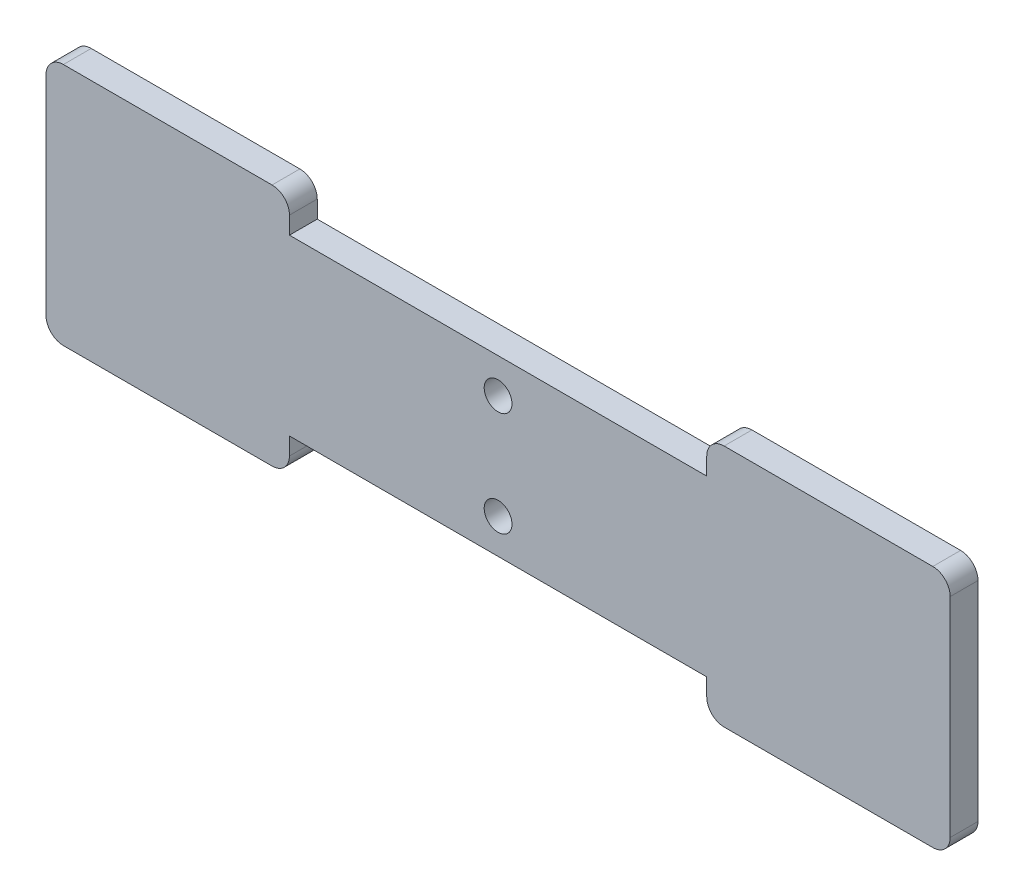
ISO-10303-21;
HEADER;
FILE_DESCRIPTION(('STEP AP214'),'2;1');
FILE_NAME('part.step','',(''),(''),'','','');
FILE_SCHEMA(('AUTOMOTIVE_DESIGN { 1 0 10303 214 1 1 1 1 }'));
ENDSEC;
DATA;
#1=APPLICATION_CONTEXT('core data for automotive mechanical design processes');
#2=APPLICATION_PROTOCOL_DEFINITION('international standard','automotive_design',2000,#1);
#3=PRODUCT_CONTEXT('',#1,'mechanical');
#4=PRODUCT('Part','Part','',(#3));
#5=PRODUCT_RELATED_PRODUCT_CATEGORY('part','',(#4));
#6=PRODUCT_DEFINITION_FORMATION('','',#4);
#7=PRODUCT_DEFINITION_CONTEXT('part definition',#1,'design');
#8=PRODUCT_DEFINITION('design','',#6,#7);
#9=PRODUCT_DEFINITION_SHAPE('','',#8);
#10=(LENGTH_UNIT() NAMED_UNIT(*) SI_UNIT(.MILLI.,.METRE.));
#11=(NAMED_UNIT(*) PLANE_ANGLE_UNIT() SI_UNIT($,.RADIAN.));
#12=(NAMED_UNIT(*) SI_UNIT($,.STERADIAN.) SOLID_ANGLE_UNIT());
#13=UNCERTAINTY_MEASURE_WITH_UNIT(LENGTH_MEASURE(1.E-05),#10,'distance_accuracy_value','');
#14=(GEOMETRIC_REPRESENTATION_CONTEXT(3) GLOBAL_UNCERTAINTY_ASSIGNED_CONTEXT((#13)) GLOBAL_UNIT_ASSIGNED_CONTEXT((#10,
#11,#12)) REPRESENTATION_CONTEXT('',''));
#15=CARTESIAN_POINT('',(0.,0.,0.));
#16=DIRECTION('',(0.,0.,1.));
#17=DIRECTION('',(1.,0.,0.));
#18=AXIS2_PLACEMENT_3D('',#15,#16,#17);
#19=CARTESIAN_POINT('',(-26.,-5.,1.6));
#20=DIRECTION('',(0.,1.,0.));
#21=DIRECTION('',(0.,0.,1.));
#22=AXIS2_PLACEMENT_3D('',#19,#20,#21);
#23=PLANE('',#22);
#24=DIRECTION('',(0.,0.,1.));
#25=VECTOR('',#24,1.);
#26=CARTESIAN_POINT('',(-12.,-5.,1.6));
#27=LINE('',#26,#25);
#28=CARTESIAN_POINT('',(-12.,-5.,0.));
#29=VERTEX_POINT('',#28);
#30=CARTESIAN_POINT('',(-12.,-5.,1.6));
#31=VERTEX_POINT('',#30);
#32=EDGE_CURVE('E184',#29,#31,#27,.T.);
#33=ORIENTED_EDGE('',*,*,#32,.F.);
#34=DIRECTION('',(1.,0.,0.));
#35=VECTOR('',#34,1.);
#36=CARTESIAN_POINT('',(-26.,-5.,0.));
#37=LINE('',#36,#35);
#38=CARTESIAN_POINT('',(12.,-5.,0.));
#39=VERTEX_POINT('',#38);
#40=EDGE_CURVE('E177',#29,#39,#37,.T.);
#41=ORIENTED_EDGE('',*,*,#40,.T.);
#42=DIRECTION('',(0.,0.,-1.));
#43=VECTOR('',#42,1.);
#44=CARTESIAN_POINT('',(12.,-5.,1.6));
#45=LINE('',#44,#43);
#46=CARTESIAN_POINT('',(12.,-5.,1.6));
#47=VERTEX_POINT('',#46);
#48=EDGE_CURVE('E182',#47,#39,#45,.T.);
#49=ORIENTED_EDGE('',*,*,#48,.F.);
#50=DIRECTION('',(1.,0.,0.));
#51=VECTOR('',#50,1.);
#52=CARTESIAN_POINT('',(-26.,-5.,1.6));
#53=LINE('',#52,#51);
#54=EDGE_CURVE('E240',#31,#47,#53,.T.);
#55=ORIENTED_EDGE('',*,*,#54,.F.);
#56=EDGE_LOOP('',(#33,#41,#49,#55));
#57=FACE_BOUND('',#56,.T.);
#58=ADVANCED_FACE('F39',(#57),#23,.F.);
#59=CARTESIAN_POINT('',(-26.,5.,1.6));
#60=DIRECTION('',(0.,-1.,0.));
#61=DIRECTION('',(0.,0.,-1.));
#62=AXIS2_PLACEMENT_3D('',#59,#60,#61);
#63=PLANE('',#62);
#64=DIRECTION('',(0.,0.,-1.));
#65=VECTOR('',#64,1.);
#66=CARTESIAN_POINT('',(-12.,5.,1.6));
#67=LINE('',#66,#65);
#68=CARTESIAN_POINT('',(-12.,5.,1.6));
#69=VERTEX_POINT('',#68);
#70=CARTESIAN_POINT('',(-12.,5.,0.));
#71=VERTEX_POINT('',#70);
#72=EDGE_CURVE('E255',#69,#71,#67,.T.);
#73=ORIENTED_EDGE('',*,*,#72,.F.);
#74=DIRECTION('',(-1.,0.,0.));
#75=VECTOR('',#74,1.);
#76=CARTESIAN_POINT('',(-26.,5.,1.6));
#77=LINE('',#76,#75);
#78=CARTESIAN_POINT('',(12.,5.,1.6));
#79=VERTEX_POINT('',#78);
#80=EDGE_CURVE('E241',#79,#69,#77,.T.);
#81=ORIENTED_EDGE('',*,*,#80,.F.);
#82=DIRECTION('',(0.,0.,1.));
#83=VECTOR('',#82,1.);
#84=CARTESIAN_POINT('',(12.,5.,1.6));
#85=LINE('',#84,#83);
#86=CARTESIAN_POINT('',(12.,5.,0.));
#87=VERTEX_POINT('',#86);
#88=EDGE_CURVE('E248',#87,#79,#85,.T.);
#89=ORIENTED_EDGE('',*,*,#88,.F.);
#90=DIRECTION('',(-1.,0.,0.));
#91=VECTOR('',#90,1.);
#92=CARTESIAN_POINT('',(-26.,5.,0.));
#93=LINE('',#92,#91);
#94=EDGE_CURVE('E236',#87,#71,#93,.T.);
#95=ORIENTED_EDGE('',*,*,#94,.T.);
#96=EDGE_LOOP('',(#73,#81,#89,#95));
#97=FACE_BOUND('',#96,.T.);
#98=ADVANCED_FACE('F364',(#97),#63,.F.);
#99=CARTESIAN_POINT('',(-26.,5.,1.6));
#100=DIRECTION('',(1.,0.,0.));
#101=DIRECTION('',(0.,1.,0.));
#102=AXIS2_PLACEMENT_3D('',#99,#100,#101);
#103=PLANE('',#102);
#104=DIRECTION('',(0.,-1.,0.));
#105=VECTOR('',#104,1.);
#106=CARTESIAN_POINT('',(-26.,5.,1.6));
#107=LINE('',#106,#105);
#108=CARTESIAN_POINT('',(-26.,6.,1.6));
#109=VERTEX_POINT('',#108);
#110=CARTESIAN_POINT('',(-26.,-6.,1.6));
#111=VERTEX_POINT('',#110);
#112=EDGE_CURVE('E235',#109,#111,#107,.T.);
#113=ORIENTED_EDGE('',*,*,#112,.F.);
#114=DIRECTION('',(0.,0.,-1.));
#115=VECTOR('',#114,1.);
#116=CARTESIAN_POINT('',(-26.,6.,1.6));
#117=LINE('',#116,#115);
#118=CARTESIAN_POINT('',(-26.,6.,0.));
#119=VERTEX_POINT('',#118);
#120=EDGE_CURVE('E11',#109,#119,#117,.T.);
#121=ORIENTED_EDGE('',*,*,#120,.T.);
#122=DIRECTION('',(0.,-1.,0.));
#123=VECTOR('',#122,1.);
#124=CARTESIAN_POINT('',(-26.,5.,0.));
#125=LINE('',#124,#123);
#126=CARTESIAN_POINT('',(-26.,-6.,0.));
#127=VERTEX_POINT('',#126);
#128=EDGE_CURVE('E189',#119,#127,#125,.T.);
#129=ORIENTED_EDGE('',*,*,#128,.T.);
#130=DIRECTION('',(0.,0.,-1.));
#131=VECTOR('',#130,1.);
#132=CARTESIAN_POINT('',(-26.,-6.,1.6));
#133=LINE('',#132,#131);
#134=EDGE_CURVE('E50',#127,#111,#133,.F.);
#135=ORIENTED_EDGE('',*,*,#134,.T.);
#136=EDGE_LOOP('',(#113,#121,#129,#135));
#137=FACE_BOUND('',#136,.T.);
#138=ADVANCED_FACE('F323',(#137),#103,.F.);
#139=CARTESIAN_POINT('',(26.,5.,1.6));
#140=DIRECTION('',(-1.,0.,0.));
#141=DIRECTION('',(0.,-1.,0.));
#142=AXIS2_PLACEMENT_3D('',#139,#140,#141);
#143=PLANE('',#142);
#144=DIRECTION('',(0.,1.,0.));
#145=VECTOR('',#144,1.);
#146=CARTESIAN_POINT('',(26.,5.,0.));
#147=LINE('',#146,#145);
#148=CARTESIAN_POINT('',(26.,-6.,0.));
#149=VERTEX_POINT('',#148);
#150=CARTESIAN_POINT('',(26.,6.,0.));
#151=VERTEX_POINT('',#150);
#152=EDGE_CURVE('E186',#149,#151,#147,.T.);
#153=ORIENTED_EDGE('',*,*,#152,.T.);
#154=DIRECTION('',(0.,0.,-1.));
#155=VECTOR('',#154,1.);
#156=CARTESIAN_POINT('',(26.,6.,1.6));
#157=LINE('',#156,#155);
#158=CARTESIAN_POINT('',(26.,6.,1.6));
#159=VERTEX_POINT('',#158);
#160=EDGE_CURVE('E305',#151,#159,#157,.F.);
#161=ORIENTED_EDGE('',*,*,#160,.T.);
#162=DIRECTION('',(0.,1.,0.));
#163=VECTOR('',#162,1.);
#164=CARTESIAN_POINT('',(26.,5.,1.6));
#165=LINE('',#164,#163);
#166=CARTESIAN_POINT('',(26.,-6.,1.6));
#167=VERTEX_POINT('',#166);
#168=EDGE_CURVE('E238',#167,#159,#165,.T.);
#169=ORIENTED_EDGE('',*,*,#168,.F.);
#170=DIRECTION('',(0.,0.,-1.));
#171=VECTOR('',#170,1.);
#172=CARTESIAN_POINT('',(26.,-6.,1.6));
#173=LINE('',#172,#171);
#174=EDGE_CURVE('E303',#167,#149,#173,.T.);
#175=ORIENTED_EDGE('',*,*,#174,.T.);
#176=EDGE_LOOP('',(#153,#161,#169,#175));
#177=FACE_BOUND('',#176,.T.);
#178=ADVANCED_FACE('F399',(#177),#143,.F.);
#179=CARTESIAN_POINT('',(0.,0.,1.6));
#180=DIRECTION('',(0.,0.,1.));
#181=DIRECTION('',(1.,0.,0.));
#182=AXIS2_PLACEMENT_3D('',#179,#180,#181);
#183=PLANE('',#182);
#184=DIRECTION('',(0.,1.,0.));
#185=VECTOR('',#184,1.);
#186=CARTESIAN_POINT('',(-12.,7.,1.6));
#187=LINE('',#186,#185);
#188=CARTESIAN_POINT('',(-12.,6.,1.6));
#189=VERTEX_POINT('',#188);
#190=EDGE_CURVE('E371',#69,#189,#187,.T.);
#191=ORIENTED_EDGE('',*,*,#190,.T.);
#192=CARTESIAN_POINT('',(-13.,6.,1.6));
#193=DIRECTION('',(0.,0.,1.));
#194=DIRECTION('',(1.,0.,0.));
#195=AXIS2_PLACEMENT_3D('',#192,#193,#194);
#196=CIRCLE('',#195,1.);
#197=CARTESIAN_POINT('',(-13.,7.,1.6));
#198=VERTEX_POINT('',#197);
#199=EDGE_CURVE('E295',#189,#198,#196,.T.);
#200=ORIENTED_EDGE('',*,*,#199,.T.);
#201=DIRECTION('',(-1.,0.,0.));
#202=VECTOR('',#201,1.);
#203=CARTESIAN_POINT('',(-26.,7.,1.6));
#204=LINE('',#203,#202);
#205=CARTESIAN_POINT('',(-25.,7.,1.6));
#206=VERTEX_POINT('',#205);
#207=EDGE_CURVE('E200',#198,#206,#204,.T.);
#208=ORIENTED_EDGE('',*,*,#207,.T.);
#209=CARTESIAN_POINT('',(-25.,6.,1.6));
#210=DIRECTION('',(0.,0.,1.));
#211=DIRECTION('',(1.,0.,0.));
#212=AXIS2_PLACEMENT_3D('',#209,#210,#211);
#213=CIRCLE('',#212,1.);
#214=EDGE_CURVE('E283',#206,#109,#213,.T.);
#215=ORIENTED_EDGE('',*,*,#214,.T.);
#216=ORIENTED_EDGE('',*,*,#112,.T.);
#217=CARTESIAN_POINT('',(-25.,-6.,1.6));
#218=DIRECTION('',(0.,0.,1.));
#219=DIRECTION('',(1.,0.,0.));
#220=AXIS2_PLACEMENT_3D('',#217,#218,#219);
#221=CIRCLE('',#220,1.);
#222=CARTESIAN_POINT('',(-25.,-7.,1.6));
#223=VERTEX_POINT('',#222);
#224=EDGE_CURVE('E276',#111,#223,#221,.T.);
#225=ORIENTED_EDGE('',*,*,#224,.T.);
#226=DIRECTION('',(1.,0.,0.));
#227=VECTOR('',#226,1.);
#228=CARTESIAN_POINT('',(-26.,-7.,1.6));
#229=LINE('',#228,#227);
#230=CARTESIAN_POINT('',(-13.,-7.,1.6));
#231=VERTEX_POINT('',#230);
#232=EDGE_CURVE('E343',#223,#231,#229,.T.);
#233=ORIENTED_EDGE('',*,*,#232,.T.);
#234=CARTESIAN_POINT('',(-13.,-6.,1.6));
#235=DIRECTION('',(0.,0.,1.));
#236=DIRECTION('',(1.,0.,0.));
#237=AXIS2_PLACEMENT_3D('',#234,#235,#236);
#238=CIRCLE('',#237,1.);
#239=CARTESIAN_POINT('',(-12.,-6.,1.6));
#240=VERTEX_POINT('',#239);
#241=EDGE_CURVE('E281',#231,#240,#238,.T.);
#242=ORIENTED_EDGE('',*,*,#241,.T.);
#243=EDGE_CURVE('E373',#240,#31,#187,.T.);
#244=ORIENTED_EDGE('',*,*,#243,.T.);
#245=ORIENTED_EDGE('',*,*,#54,.T.);
#246=DIRECTION('',(0.,-1.,0.));
#247=VECTOR('',#246,1.);
#248=CARTESIAN_POINT('',(12.,-7.,1.6));
#249=LINE('',#248,#247);
#250=CARTESIAN_POINT('',(12.,-6.,1.6));
#251=VERTEX_POINT('',#250);
#252=EDGE_CURVE('E196',#47,#251,#249,.T.);
#253=ORIENTED_EDGE('',*,*,#252,.T.);
#254=CARTESIAN_POINT('',(13.,-6.,1.6));
#255=DIRECTION('',(0.,0.,1.));
#256=DIRECTION('',(1.,0.,0.));
#257=AXIS2_PLACEMENT_3D('',#254,#255,#256);
#258=CIRCLE('',#257,1.);
#259=CARTESIAN_POINT('',(13.,-7.,1.6));
#260=VERTEX_POINT('',#259);
#261=EDGE_CURVE('E282',#251,#260,#258,.T.);
#262=ORIENTED_EDGE('',*,*,#261,.T.);
#263=DIRECTION('',(1.,0.,0.));
#264=VECTOR('',#263,1.);
#265=CARTESIAN_POINT('',(12.,-7.,1.6));
#266=LINE('',#265,#264);
#267=CARTESIAN_POINT('',(25.,-7.,1.6));
#268=VERTEX_POINT('',#267);
#269=EDGE_CURVE('E216',#260,#268,#266,.T.);
#270=ORIENTED_EDGE('',*,*,#269,.T.);
#271=CARTESIAN_POINT('',(25.,-6.,1.6));
#272=DIRECTION('',(0.,0.,1.));
#273=DIRECTION('',(1.,0.,0.));
#274=AXIS2_PLACEMENT_3D('',#271,#272,#273);
#275=CIRCLE('',#274,1.);
#276=EDGE_CURVE('E289',#268,#167,#275,.T.);
#277=ORIENTED_EDGE('',*,*,#276,.T.);
#278=ORIENTED_EDGE('',*,*,#168,.T.);
#279=CARTESIAN_POINT('',(25.,6.,1.6));
#280=DIRECTION('',(0.,0.,1.));
#281=DIRECTION('',(1.,0.,0.));
#282=AXIS2_PLACEMENT_3D('',#279,#280,#281);
#283=CIRCLE('',#282,1.);
#284=CARTESIAN_POINT('',(25.,7.,1.6));
#285=VERTEX_POINT('',#284);
#286=EDGE_CURVE('E290',#159,#285,#283,.T.);
#287=ORIENTED_EDGE('',*,*,#286,.T.);
#288=DIRECTION('',(-1.,0.,0.));
#289=VECTOR('',#288,1.);
#290=CARTESIAN_POINT('',(12.,7.,1.6));
#291=LINE('',#290,#289);
#292=CARTESIAN_POINT('',(13.,7.,1.6));
#293=VERTEX_POINT('',#292);
#294=EDGE_CURVE('E212',#285,#293,#291,.T.);
#295=ORIENTED_EDGE('',*,*,#294,.T.);
#296=CARTESIAN_POINT('',(13.,6.,1.6));
#297=DIRECTION('',(0.,0.,1.));
#298=DIRECTION('',(1.,0.,0.));
#299=AXIS2_PLACEMENT_3D('',#296,#297,#298);
#300=CIRCLE('',#299,1.);
#301=CARTESIAN_POINT('',(12.,6.,1.6));
#302=VERTEX_POINT('',#301);
#303=EDGE_CURVE('E53',#293,#302,#300,.T.);
#304=ORIENTED_EDGE('',*,*,#303,.T.);
#305=EDGE_CURVE('E218',#302,#79,#249,.T.);
#306=ORIENTED_EDGE('',*,*,#305,.T.);
#307=ORIENTED_EDGE('',*,*,#80,.T.);
#308=EDGE_LOOP('',(#191,#200,#208,#215,#216,#225,#233,#242,#244,#245,#253,#262,#270,#277,#278,
#287,#295,#304,#306,#307));
#309=FACE_BOUND('',#308,.T.);
#310=CARTESIAN_POINT('',(0.,3.,1.6));
#311=DIRECTION('',(0.,0.,1.));
#312=DIRECTION('',(1.,0.,0.));
#313=AXIS2_PLACEMENT_3D('',#310,#311,#312);
#314=CIRCLE('',#313,0.8);
#315=CARTESIAN_POINT('',(0.8,3.,1.6));
#316=VERTEX_POINT('',#315);
#317=EDGE_CURVE('E224',#316,#316,#314,.T.);
#318=ORIENTED_EDGE('',*,*,#317,.F.);
#319=EDGE_LOOP('',(#318));
#320=FACE_BOUND('',#319,.T.);
#321=CARTESIAN_POINT('',(0.,-3.,1.6));
#322=DIRECTION('',(0.,0.,1.));
#323=DIRECTION('',(1.,0.,0.));
#324=AXIS2_PLACEMENT_3D('',#321,#322,#323);
#325=CIRCLE('',#324,0.8);
#326=CARTESIAN_POINT('',(0.8,-3.,1.6));
#327=VERTEX_POINT('',#326);
#328=EDGE_CURVE('E225',#327,#327,#325,.T.);
#329=ORIENTED_EDGE('',*,*,#328,.F.);
#330=EDGE_LOOP('',(#329));
#331=FACE_BOUND('',#330,.T.);
#332=ADVANCED_FACE('F328',(#309,#320,#331),#183,.T.);
#333=CARTESIAN_POINT('',(0.,0.,0.));
#334=DIRECTION('',(0.,0.,1.));
#335=DIRECTION('',(1.,0.,0.));
#336=AXIS2_PLACEMENT_3D('',#333,#334,#335);
#337=PLANE('',#336);
#338=CARTESIAN_POINT('',(0.,3.,0.));
#339=DIRECTION('',(0.,0.,1.));
#340=DIRECTION('',(1.,0.,0.));
#341=AXIS2_PLACEMENT_3D('',#338,#339,#340);
#342=CIRCLE('',#341,0.8);
#343=CARTESIAN_POINT('',(0.8,3.,0.));
#344=VERTEX_POINT('',#343);
#345=EDGE_CURVE('E228',#344,#344,#342,.T.);
#346=ORIENTED_EDGE('',*,*,#345,.T.);
#347=EDGE_LOOP('',(#346));
#348=FACE_BOUND('',#347,.T.);
#349=CARTESIAN_POINT('',(0.,-3.,0.));
#350=DIRECTION('',(0.,0.,1.));
#351=DIRECTION('',(1.,0.,0.));
#352=AXIS2_PLACEMENT_3D('',#349,#350,#351);
#353=CIRCLE('',#352,0.8);
#354=CARTESIAN_POINT('',(0.8,-3.,0.));
#355=VERTEX_POINT('',#354);
#356=EDGE_CURVE('E229',#355,#355,#353,.T.);
#357=ORIENTED_EDGE('',*,*,#356,.T.);
#358=EDGE_LOOP('',(#357));
#359=FACE_BOUND('',#358,.T.);
#360=DIRECTION('',(-1.,0.,0.));
#361=VECTOR('',#360,1.);
#362=CARTESIAN_POINT('',(-26.,7.,0.));
#363=LINE('',#362,#361);
#364=CARTESIAN_POINT('',(-13.,7.,0.));
#365=VERTEX_POINT('',#364);
#366=CARTESIAN_POINT('',(-25.,7.,0.));
#367=VERTEX_POINT('',#366);
#368=EDGE_CURVE('E348',#365,#367,#363,.T.);
#369=ORIENTED_EDGE('',*,*,#368,.F.);
#370=CARTESIAN_POINT('',(-13.,6.,0.));
#371=DIRECTION('',(0.,0.,1.));
#372=DIRECTION('',(1.,0.,0.));
#373=AXIS2_PLACEMENT_3D('',#370,#371,#372);
#374=CIRCLE('',#373,1.);
#375=CARTESIAN_POINT('',(-12.,6.,0.));
#376=VERTEX_POINT('',#375);
#377=EDGE_CURVE('E274',#365,#376,#374,.F.);
#378=ORIENTED_EDGE('',*,*,#377,.T.);
#379=DIRECTION('',(0.,1.,0.));
#380=VECTOR('',#379,1.);
#381=CARTESIAN_POINT('',(-12.,7.,0.));
#382=LINE('',#381,#380);
#383=EDGE_CURVE('E344',#71,#376,#382,.T.);
#384=ORIENTED_EDGE('',*,*,#383,.F.);
#385=ORIENTED_EDGE('',*,*,#94,.F.);
#386=DIRECTION('',(0.,-1.,0.));
#387=VECTOR('',#386,1.);
#388=CARTESIAN_POINT('',(12.,-7.,0.));
#389=LINE('',#388,#387);
#390=CARTESIAN_POINT('',(12.,6.,0.));
#391=VERTEX_POINT('',#390);
#392=EDGE_CURVE('E202',#391,#87,#389,.T.);
#393=ORIENTED_EDGE('',*,*,#392,.F.);
#394=CARTESIAN_POINT('',(13.,6.,0.));
#395=DIRECTION('',(0.,0.,1.));
#396=DIRECTION('',(1.,0.,0.));
#397=AXIS2_PLACEMENT_3D('',#394,#395,#396);
#398=CIRCLE('',#397,1.);
#399=CARTESIAN_POINT('',(13.,7.,0.));
#400=VERTEX_POINT('',#399);
#401=EDGE_CURVE('E272',#391,#400,#398,.F.);
#402=ORIENTED_EDGE('',*,*,#401,.T.);
#403=DIRECTION('',(-1.,0.,0.));
#404=VECTOR('',#403,1.);
#405=CARTESIAN_POINT('',(12.,7.,0.));
#406=LINE('',#405,#404);
#407=CARTESIAN_POINT('',(25.,7.,0.));
#408=VERTEX_POINT('',#407);
#409=EDGE_CURVE('E209',#408,#400,#406,.T.);
#410=ORIENTED_EDGE('',*,*,#409,.F.);
#411=CARTESIAN_POINT('',(25.,6.,0.));
#412=DIRECTION('',(0.,0.,1.));
#413=DIRECTION('',(1.,0.,0.));
#414=AXIS2_PLACEMENT_3D('',#411,#412,#413);
#415=CIRCLE('',#414,1.);
#416=EDGE_CURVE('E271',#408,#151,#415,.F.);
#417=ORIENTED_EDGE('',*,*,#416,.T.);
#418=ORIENTED_EDGE('',*,*,#152,.F.);
#419=CARTESIAN_POINT('',(25.,-6.,0.));
#420=DIRECTION('',(0.,0.,1.));
#421=DIRECTION('',(1.,0.,0.));
#422=AXIS2_PLACEMENT_3D('',#419,#420,#421);
#423=CIRCLE('',#422,1.);
#424=CARTESIAN_POINT('',(25.,-7.,0.));
#425=VERTEX_POINT('',#424);
#426=EDGE_CURVE('E267',#149,#425,#423,.F.);
#427=ORIENTED_EDGE('',*,*,#426,.T.);
#428=DIRECTION('',(1.,0.,0.));
#429=VECTOR('',#428,1.);
#430=CARTESIAN_POINT('',(12.,-7.,0.));
#431=LINE('',#430,#429);
#432=CARTESIAN_POINT('',(13.,-7.,0.));
#433=VERTEX_POINT('',#432);
#434=EDGE_CURVE('E206',#433,#425,#431,.T.);
#435=ORIENTED_EDGE('',*,*,#434,.F.);
#436=CARTESIAN_POINT('',(13.,-6.,0.));
#437=DIRECTION('',(0.,0.,1.));
#438=DIRECTION('',(1.,0.,0.));
#439=AXIS2_PLACEMENT_3D('',#436,#437,#438);
#440=CIRCLE('',#439,1.);
#441=CARTESIAN_POINT('',(12.,-6.,0.));
#442=VERTEX_POINT('',#441);
#443=EDGE_CURVE('E204',#433,#442,#440,.F.);
#444=ORIENTED_EDGE('',*,*,#443,.T.);
#445=EDGE_CURVE('E191',#39,#442,#389,.T.);
#446=ORIENTED_EDGE('',*,*,#445,.F.);
#447=ORIENTED_EDGE('',*,*,#40,.F.);
#448=CARTESIAN_POINT('',(-12.,-6.,0.));
#449=VERTEX_POINT('',#448);
#450=EDGE_CURVE('E341',#449,#29,#382,.T.);
#451=ORIENTED_EDGE('',*,*,#450,.F.);
#452=CARTESIAN_POINT('',(-13.,-6.,0.));
#453=DIRECTION('',(0.,0.,1.));
#454=DIRECTION('',(1.,0.,0.));
#455=AXIS2_PLACEMENT_3D('',#452,#453,#454);
#456=CIRCLE('',#455,1.);
#457=CARTESIAN_POINT('',(-13.,-7.,0.));
#458=VERTEX_POINT('',#457);
#459=EDGE_CURVE('E266',#449,#458,#456,.F.);
#460=ORIENTED_EDGE('',*,*,#459,.T.);
#461=DIRECTION('',(1.,0.,0.));
#462=VECTOR('',#461,1.);
#463=CARTESIAN_POINT('',(-26.,-7.,0.));
#464=LINE('',#463,#462);
#465=CARTESIAN_POINT('',(-25.,-7.,0.));
#466=VERTEX_POINT('',#465);
#467=EDGE_CURVE('E208',#466,#458,#464,.T.);
#468=ORIENTED_EDGE('',*,*,#467,.F.);
#469=CARTESIAN_POINT('',(-25.,-6.,0.));
#470=DIRECTION('',(0.,0.,1.));
#471=DIRECTION('',(1.,0.,0.));
#472=AXIS2_PLACEMENT_3D('',#469,#470,#471);
#473=CIRCLE('',#472,1.);
#474=EDGE_CURVE('E265',#466,#127,#473,.F.);
#475=ORIENTED_EDGE('',*,*,#474,.T.);
#476=ORIENTED_EDGE('',*,*,#128,.F.);
#477=CARTESIAN_POINT('',(-25.,6.,0.));
#478=DIRECTION('',(0.,0.,1.));
#479=DIRECTION('',(1.,0.,0.));
#480=AXIS2_PLACEMENT_3D('',#477,#478,#479);
#481=CIRCLE('',#480,1.);
#482=EDGE_CURVE('E262',#119,#367,#481,.F.);
#483=ORIENTED_EDGE('',*,*,#482,.T.);
#484=EDGE_LOOP('',(#369,#378,#384,#385,#393,#402,#410,#417,#418,#427,#435,#444,#446,#447,#451,
#460,#468,#475,#476,#483));
#485=FACE_BOUND('',#484,.T.);
#486=ADVANCED_FACE('F205',(#348,#359,#485),#337,.F.);
#487=CARTESIAN_POINT('',(0.,-3.,1.6));
#488=DIRECTION('',(0.,0.,-1.));
#489=DIRECTION('',(-1.,0.,0.));
#490=AXIS2_PLACEMENT_3D('',#487,#488,#489);
#491=CYLINDRICAL_SURFACE('',#490,0.8);
#492=ORIENTED_EDGE('',*,*,#328,.T.);
#493=EDGE_LOOP('',(#492));
#494=FACE_BOUND('',#493,.T.);
#495=ORIENTED_EDGE('',*,*,#356,.F.);
#496=EDGE_LOOP('',(#495));
#497=FACE_BOUND('',#496,.T.);
#498=ADVANCED_FACE('F555',(#494,#497),#491,.F.);
#499=CARTESIAN_POINT('',(0.,3.,1.6));
#500=DIRECTION('',(0.,0.,-1.));
#501=DIRECTION('',(-1.,0.,0.));
#502=AXIS2_PLACEMENT_3D('',#499,#500,#501);
#503=CYLINDRICAL_SURFACE('',#502,0.8);
#504=ORIENTED_EDGE('',*,*,#317,.T.);
#505=EDGE_LOOP('',(#504));
#506=FACE_BOUND('',#505,.T.);
#507=ORIENTED_EDGE('',*,*,#345,.F.);
#508=EDGE_LOOP('',(#507));
#509=FACE_BOUND('',#508,.T.);
#510=ADVANCED_FACE('F534',(#506,#509),#503,.F.);
#511=CARTESIAN_POINT('',(12.,7.,1.6));
#512=DIRECTION('',(0.,-1.,0.));
#513=DIRECTION('',(0.,0.,-1.));
#514=AXIS2_PLACEMENT_3D('',#511,#512,#513);
#515=PLANE('',#514);
#516=ORIENTED_EDGE('',*,*,#409,.T.);
#517=DIRECTION('',(0.,0.,-1.));
#518=VECTOR('',#517,1.);
#519=CARTESIAN_POINT('',(13.,7.,1.6));
#520=LINE('',#519,#518);
#521=EDGE_CURVE('E65',#400,#293,#520,.F.);
#522=ORIENTED_EDGE('',*,*,#521,.T.);
#523=ORIENTED_EDGE('',*,*,#294,.F.);
#524=DIRECTION('',(0.,0.,-1.));
#525=VECTOR('',#524,1.);
#526=CARTESIAN_POINT('',(25.,7.,1.6));
#527=LINE('',#526,#525);
#528=EDGE_CURVE('E300',#285,#408,#527,.T.);
#529=ORIENTED_EDGE('',*,*,#528,.T.);
#530=EDGE_LOOP('',(#516,#522,#523,#529));
#531=FACE_BOUND('',#530,.T.);
#532=ADVANCED_FACE('F351',(#531),#515,.F.);
#533=CARTESIAN_POINT('',(12.,-7.,1.6));
#534=DIRECTION('',(1.,0.,0.));
#535=DIRECTION('',(0.,0.,-1.));
#536=AXIS2_PLACEMENT_3D('',#533,#534,#535);
#537=PLANE('',#536);
#538=ORIENTED_EDGE('',*,*,#305,.F.);
#539=DIRECTION('',(0.,0.,-1.));
#540=VECTOR('',#539,1.);
#541=CARTESIAN_POINT('',(12.,6.,1.6));
#542=LINE('',#541,#540);
#543=EDGE_CURVE('E294',#302,#391,#542,.T.);
#544=ORIENTED_EDGE('',*,*,#543,.T.);
#545=ORIENTED_EDGE('',*,*,#392,.T.);
#546=ORIENTED_EDGE('',*,*,#88,.T.);
#547=EDGE_LOOP('',(#538,#544,#545,#546));
#548=FACE_BOUND('',#547,.T.);
#549=ADVANCED_FACE('F356',(#548),#537,.F.);
#550=CARTESIAN_POINT('',(-26.,7.,1.6));
#551=DIRECTION('',(0.,-1.,0.));
#552=DIRECTION('',(0.,0.,-1.));
#553=AXIS2_PLACEMENT_3D('',#550,#551,#552);
#554=PLANE('',#553);
#555=ORIENTED_EDGE('',*,*,#207,.F.);
#556=DIRECTION('',(0.,0.,-1.));
#557=VECTOR('',#556,1.);
#558=CARTESIAN_POINT('',(-13.,7.,1.6));
#559=LINE('',#558,#557);
#560=EDGE_CURVE('E259',#198,#365,#559,.T.);
#561=ORIENTED_EDGE('',*,*,#560,.T.);
#562=ORIENTED_EDGE('',*,*,#368,.T.);
#563=DIRECTION('',(0.,0.,-1.));
#564=VECTOR('',#563,1.);
#565=CARTESIAN_POINT('',(-25.,7.,1.6));
#566=LINE('',#565,#564);
#567=EDGE_CURVE('E260',#367,#206,#566,.F.);
#568=ORIENTED_EDGE('',*,*,#567,.T.);
#569=EDGE_LOOP('',(#555,#561,#562,#568));
#570=FACE_BOUND('',#569,.T.);
#571=ADVANCED_FACE('F431',(#570),#554,.F.);
#572=CARTESIAN_POINT('',(-12.,7.,1.6));
#573=DIRECTION('',(-1.,0.,0.));
#574=DIRECTION('',(0.,0.,1.));
#575=AXIS2_PLACEMENT_3D('',#572,#573,#574);
#576=PLANE('',#575);
#577=ORIENTED_EDGE('',*,*,#383,.T.);
#578=DIRECTION('',(0.,0.,-1.));
#579=VECTOR('',#578,1.);
#580=CARTESIAN_POINT('',(-12.,6.,1.6));
#581=LINE('',#580,#579);
#582=EDGE_CURVE('E280',#376,#189,#581,.F.);
#583=ORIENTED_EDGE('',*,*,#582,.T.);
#584=ORIENTED_EDGE('',*,*,#190,.F.);
#585=ORIENTED_EDGE('',*,*,#72,.T.);
#586=EDGE_LOOP('',(#577,#583,#584,#585));
#587=FACE_BOUND('',#586,.T.);
#588=ADVANCED_FACE('F369',(#587),#576,.F.);
#589=ORIENTED_EDGE('',*,*,#445,.T.);
#590=DIRECTION('',(0.,0.,-1.));
#591=VECTOR('',#590,1.);
#592=CARTESIAN_POINT('',(12.,-6.,1.6));
#593=LINE('',#592,#591);
#594=EDGE_CURVE('E313',#442,#251,#593,.F.);
#595=ORIENTED_EDGE('',*,*,#594,.T.);
#596=ORIENTED_EDGE('',*,*,#252,.F.);
#597=ORIENTED_EDGE('',*,*,#48,.T.);
#598=EDGE_LOOP('',(#589,#595,#596,#597));
#599=FACE_BOUND('',#598,.T.);
#600=ADVANCED_FACE('F195',(#599),#537,.F.);
#601=CARTESIAN_POINT('',(12.,-7.,1.6));
#602=DIRECTION('',(0.,1.,0.));
#603=DIRECTION('',(0.,0.,1.));
#604=AXIS2_PLACEMENT_3D('',#601,#602,#603);
#605=PLANE('',#604);
#606=ORIENTED_EDGE('',*,*,#434,.T.);
#607=DIRECTION('',(0.,0.,-1.));
#608=VECTOR('',#607,1.);
#609=CARTESIAN_POINT('',(25.,-7.,1.6));
#610=LINE('',#609,#608);
#611=EDGE_CURVE('E310',#425,#268,#610,.F.);
#612=ORIENTED_EDGE('',*,*,#611,.T.);
#613=ORIENTED_EDGE('',*,*,#269,.F.);
#614=DIRECTION('',(0.,0.,-1.));
#615=VECTOR('',#614,1.);
#616=CARTESIAN_POINT('',(13.,-7.,1.6));
#617=LINE('',#616,#615);
#618=EDGE_CURVE('E308',#260,#433,#617,.T.);
#619=ORIENTED_EDGE('',*,*,#618,.T.);
#620=EDGE_LOOP('',(#606,#612,#613,#619));
#621=FACE_BOUND('',#620,.T.);
#622=ADVANCED_FACE('F389',(#621),#605,.F.);
#623=ORIENTED_EDGE('',*,*,#243,.F.);
#624=DIRECTION('',(0.,0.,-1.));
#625=VECTOR('',#624,1.);
#626=CARTESIAN_POINT('',(-12.,-6.,1.6));
#627=LINE('',#626,#625);
#628=EDGE_CURVE('E311',#240,#449,#627,.T.);
#629=ORIENTED_EDGE('',*,*,#628,.T.);
#630=ORIENTED_EDGE('',*,*,#450,.T.);
#631=ORIENTED_EDGE('',*,*,#32,.T.);
#632=EDGE_LOOP('',(#623,#629,#630,#631));
#633=FACE_BOUND('',#632,.T.);
#634=ADVANCED_FACE('F381',(#633),#576,.F.);
#635=CARTESIAN_POINT('',(-26.,-7.,1.6));
#636=DIRECTION('',(0.,1.,0.));
#637=DIRECTION('',(0.,0.,1.));
#638=AXIS2_PLACEMENT_3D('',#635,#636,#637);
#639=PLANE('',#638);
#640=ORIENTED_EDGE('',*,*,#467,.T.);
#641=DIRECTION('',(0.,0.,-1.));
#642=VECTOR('',#641,1.);
#643=CARTESIAN_POINT('',(-13.,-7.,1.6));
#644=LINE('',#643,#642);
#645=EDGE_CURVE('E317',#458,#231,#644,.F.);
#646=ORIENTED_EDGE('',*,*,#645,.T.);
#647=ORIENTED_EDGE('',*,*,#232,.F.);
#648=DIRECTION('',(0.,0.,-1.));
#649=VECTOR('',#648,1.);
#650=CARTESIAN_POINT('',(-25.,-7.,1.6));
#651=LINE('',#650,#649);
#652=EDGE_CURVE('E316',#223,#466,#651,.T.);
#653=ORIENTED_EDGE('',*,*,#652,.T.);
#654=EDGE_LOOP('',(#640,#646,#647,#653));
#655=FACE_BOUND('',#654,.T.);
#656=ADVANCED_FACE('F339',(#655),#639,.F.);
#657=CARTESIAN_POINT('',(-13.,6.,1.6));
#658=DIRECTION('',(0.,0.,-1.));
#659=DIRECTION('',(-1.,0.,0.));
#660=AXIS2_PLACEMENT_3D('',#657,#658,#659);
#661=CYLINDRICAL_SURFACE('',#660,1.);
#662=ORIENTED_EDGE('',*,*,#199,.F.);
#663=ORIENTED_EDGE('',*,*,#582,.F.);
#664=ORIENTED_EDGE('',*,*,#377,.F.);
#665=ORIENTED_EDGE('',*,*,#560,.F.);
#666=EDGE_LOOP('',(#662,#663,#664,#665));
#667=FACE_BOUND('',#666,.T.);
#668=ADVANCED_FACE('F409',(#667),#661,.T.);
#669=CARTESIAN_POINT('',(13.,6.,1.6));
#670=DIRECTION('',(0.,0.,-1.));
#671=DIRECTION('',(-1.,0.,0.));
#672=AXIS2_PLACEMENT_3D('',#669,#670,#671);
#673=CYLINDRICAL_SURFACE('',#672,1.);
#674=ORIENTED_EDGE('',*,*,#303,.F.);
#675=ORIENTED_EDGE('',*,*,#521,.F.);
#676=ORIENTED_EDGE('',*,*,#401,.F.);
#677=ORIENTED_EDGE('',*,*,#543,.F.);
#678=EDGE_LOOP('',(#674,#675,#676,#677));
#679=FACE_BOUND('',#678,.T.);
#680=ADVANCED_FACE('F358',(#679),#673,.T.);
#681=CARTESIAN_POINT('',(25.,6.,1.6));
#682=DIRECTION('',(0.,0.,-1.));
#683=DIRECTION('',(-1.,0.,0.));
#684=AXIS2_PLACEMENT_3D('',#681,#682,#683);
#685=CYLINDRICAL_SURFACE('',#684,1.);
#686=ORIENTED_EDGE('',*,*,#286,.F.);
#687=ORIENTED_EDGE('',*,*,#160,.F.);
#688=ORIENTED_EDGE('',*,*,#416,.F.);
#689=ORIENTED_EDGE('',*,*,#528,.F.);
#690=EDGE_LOOP('',(#686,#687,#688,#689));
#691=FACE_BOUND('',#690,.T.);
#692=ADVANCED_FACE('F402',(#691),#685,.T.);
#693=CARTESIAN_POINT('',(25.,-6.,1.6));
#694=DIRECTION('',(0.,0.,-1.));
#695=DIRECTION('',(-1.,0.,0.));
#696=AXIS2_PLACEMENT_3D('',#693,#694,#695);
#697=CYLINDRICAL_SURFACE('',#696,1.);
#698=ORIENTED_EDGE('',*,*,#276,.F.);
#699=ORIENTED_EDGE('',*,*,#611,.F.);
#700=ORIENTED_EDGE('',*,*,#426,.F.);
#701=ORIENTED_EDGE('',*,*,#174,.F.);
#702=EDGE_LOOP('',(#698,#699,#700,#701));
#703=FACE_BOUND('',#702,.T.);
#704=ADVANCED_FACE('F394',(#703),#697,.T.);
#705=CARTESIAN_POINT('',(13.,-6.,1.6));
#706=DIRECTION('',(0.,0.,-1.));
#707=DIRECTION('',(-1.,0.,0.));
#708=AXIS2_PLACEMENT_3D('',#705,#706,#707);
#709=CYLINDRICAL_SURFACE('',#708,1.);
#710=ORIENTED_EDGE('',*,*,#261,.F.);
#711=ORIENTED_EDGE('',*,*,#594,.F.);
#712=ORIENTED_EDGE('',*,*,#443,.F.);
#713=ORIENTED_EDGE('',*,*,#618,.F.);
#714=EDGE_LOOP('',(#710,#711,#712,#713));
#715=FACE_BOUND('',#714,.T.);
#716=ADVANCED_FACE('F387',(#715),#709,.T.);
#717=CARTESIAN_POINT('',(-13.,-6.,1.6));
#718=DIRECTION('',(0.,0.,-1.));
#719=DIRECTION('',(-1.,0.,0.));
#720=AXIS2_PLACEMENT_3D('',#717,#718,#719);
#721=CYLINDRICAL_SURFACE('',#720,1.);
#722=ORIENTED_EDGE('',*,*,#241,.F.);
#723=ORIENTED_EDGE('',*,*,#645,.F.);
#724=ORIENTED_EDGE('',*,*,#459,.F.);
#725=ORIENTED_EDGE('',*,*,#628,.F.);
#726=EDGE_LOOP('',(#722,#723,#724,#725));
#727=FACE_BOUND('',#726,.T.);
#728=ADVANCED_FACE('F377',(#727),#721,.T.);
#729=CARTESIAN_POINT('',(-25.,6.,1.6));
#730=DIRECTION('',(0.,0.,-1.));
#731=DIRECTION('',(-1.,0.,0.));
#732=AXIS2_PLACEMENT_3D('',#729,#730,#731);
#733=CYLINDRICAL_SURFACE('',#732,1.);
#734=ORIENTED_EDGE('',*,*,#214,.F.);
#735=ORIENTED_EDGE('',*,*,#567,.F.);
#736=ORIENTED_EDGE('',*,*,#482,.F.);
#737=ORIENTED_EDGE('',*,*,#120,.F.);
#738=EDGE_LOOP('',(#734,#735,#736,#737));
#739=FACE_BOUND('',#738,.T.);
#740=ADVANCED_FACE('F432',(#739),#733,.T.);
#741=CARTESIAN_POINT('',(-25.,-6.,1.6));
#742=DIRECTION('',(0.,0.,-1.));
#743=DIRECTION('',(-1.,0.,0.));
#744=AXIS2_PLACEMENT_3D('',#741,#742,#743);
#745=CYLINDRICAL_SURFACE('',#744,1.);
#746=ORIENTED_EDGE('',*,*,#224,.F.);
#747=ORIENTED_EDGE('',*,*,#134,.F.);
#748=ORIENTED_EDGE('',*,*,#474,.F.);
#749=ORIENTED_EDGE('',*,*,#652,.F.);
#750=EDGE_LOOP('',(#746,#747,#748,#749));
#751=FACE_BOUND('',#750,.T.);
#752=ADVANCED_FACE('F41',(#751),#745,.T.);
#753=CLOSED_SHELL('',(#58,#98,#138,#178,#332,#486,#498,#510,#532,#549,#571,#588,#600,#622,#634,
#656,#668,#680,#692,#704,#716,#728,#740,#752));
#754=MANIFOLD_SOLID_BREP('B2',#753);
#755=ADVANCED_BREP_SHAPE_REPRESENTATION('',(#18,#754),#14);
#756=SHAPE_DEFINITION_REPRESENTATION(#9,#755);
ENDSEC;
END-ISO-10303-21;
